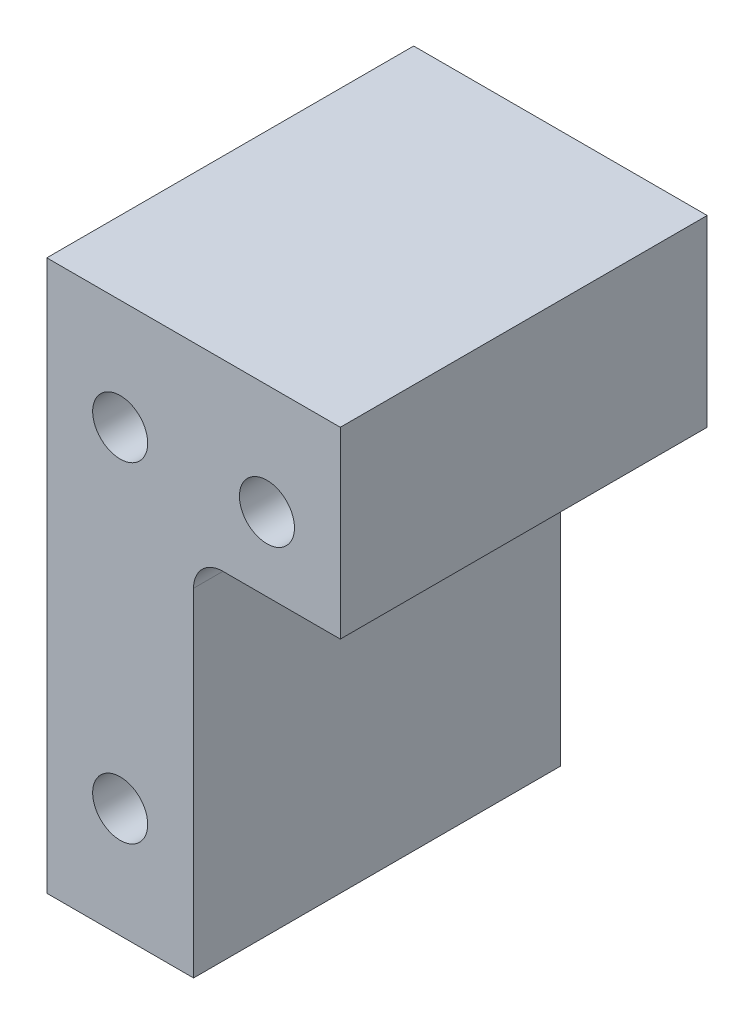
ISO-10303-21;
HEADER;
FILE_DESCRIPTION(('STEP AP214'),'2;1');
FILE_NAME('part.step','',(''),(''),'','','');
FILE_SCHEMA(('AUTOMOTIVE_DESIGN { 1 0 10303 214 1 1 1 1 }'));
ENDSEC;
DATA;
#1=APPLICATION_CONTEXT('core data for automotive mechanical design processes');
#2=APPLICATION_PROTOCOL_DEFINITION('international standard','automotive_design',2000,#1);
#3=PRODUCT_CONTEXT('',#1,'mechanical');
#4=PRODUCT('Part','Part','',(#3));
#5=PRODUCT_RELATED_PRODUCT_CATEGORY('part','',(#4));
#6=PRODUCT_DEFINITION_FORMATION('','',#4);
#7=PRODUCT_DEFINITION_CONTEXT('part definition',#1,'design');
#8=PRODUCT_DEFINITION('design','',#6,#7);
#9=PRODUCT_DEFINITION_SHAPE('','',#8);
#10=(LENGTH_UNIT() NAMED_UNIT(*) SI_UNIT(.MILLI.,.METRE.));
#11=(NAMED_UNIT(*) PLANE_ANGLE_UNIT() SI_UNIT($,.RADIAN.));
#12=(NAMED_UNIT(*) SI_UNIT($,.STERADIAN.) SOLID_ANGLE_UNIT());
#13=UNCERTAINTY_MEASURE_WITH_UNIT(LENGTH_MEASURE(1.E-05),#10,'distance_accuracy_value','');
#14=(GEOMETRIC_REPRESENTATION_CONTEXT(3) GLOBAL_UNCERTAINTY_ASSIGNED_CONTEXT((#13)) GLOBAL_UNIT_ASSIGNED_CONTEXT((#10,
#11,#12)) REPRESENTATION_CONTEXT('',''));
#15=CARTESIAN_POINT('',(0.,0.,0.));
#16=DIRECTION('',(0.,0.,1.));
#17=DIRECTION('',(1.,0.,0.));
#18=AXIS2_PLACEMENT_3D('',#15,#16,#17);
#19=CARTESIAN_POINT('',(12.192,23.368,25.4));
#20=DIRECTION('',(0.,0.,1.));
#21=DIRECTION('',(1.,0.,0.));
#22=AXIS2_PLACEMENT_3D('',#19,#20,#21);
#23=PLANE('',#22);
#24=CARTESIAN_POINT('',(5.08,7.62,25.4));
#25=DIRECTION('',(0.,0.,1.));
#26=DIRECTION('',(1.,0.,0.));
#27=AXIS2_PLACEMENT_3D('',#24,#25,#26);
#28=CIRCLE('',#27,1.905);
#29=CARTESIAN_POINT('',(6.985,7.62,25.4));
#30=VERTEX_POINT('',#29);
#31=EDGE_CURVE('E164',#30,#30,#28,.T.);
#32=ORIENTED_EDGE('',*,*,#31,.F.);
#33=EDGE_LOOP('',(#32));
#34=FACE_BOUND('',#33,.T.);
#35=DIRECTION('',(1.,0.,0.));
#36=VECTOR('',#35,1.);
#37=CARTESIAN_POINT('',(10.16,0.,25.4));
#38=LINE('',#37,#36);
#39=CARTESIAN_POINT('',(0.,0.,25.4));
#40=VERTEX_POINT('',#39);
#41=CARTESIAN_POINT('',(10.16,0.,25.4));
#42=VERTEX_POINT('',#41);
#43=EDGE_CURVE('E137',#40,#42,#38,.T.);
#44=ORIENTED_EDGE('',*,*,#43,.T.);
#45=DIRECTION('',(0.,1.,0.));
#46=VECTOR('',#45,1.);
#47=CARTESIAN_POINT('',(10.16,23.368,25.4));
#48=LINE('',#47,#46);
#49=CARTESIAN_POINT('',(10.16,23.368,25.4));
#50=VERTEX_POINT('',#49);
#51=EDGE_CURVE('E90',#42,#50,#48,.T.);
#52=ORIENTED_EDGE('',*,*,#51,.T.);
#53=CARTESIAN_POINT('',(12.192,23.368,25.4));
#54=DIRECTION('',(0.,0.,-1.));
#55=DIRECTION('',(1.,0.,0.));
#56=AXIS2_PLACEMENT_3D('',#53,#54,#55);
#57=CIRCLE('',#56,2.032);
#58=CARTESIAN_POINT('',(12.192,25.4,25.4));
#59=VERTEX_POINT('',#58);
#60=EDGE_CURVE('E149',#50,#59,#57,.T.);
#61=ORIENTED_EDGE('',*,*,#60,.T.);
#62=DIRECTION('',(1.,0.,0.));
#63=VECTOR('',#62,1.);
#64=CARTESIAN_POINT('',(20.32,25.4,25.4));
#65=LINE('',#64,#63);
#66=CARTESIAN_POINT('',(20.32,25.4,25.4));
#67=VERTEX_POINT('',#66);
#68=EDGE_CURVE('E106',#59,#67,#65,.T.);
#69=ORIENTED_EDGE('',*,*,#68,.T.);
#70=DIRECTION('',(0.,1.,0.));
#71=VECTOR('',#70,1.);
#72=CARTESIAN_POINT('',(20.32,38.1,25.4));
#73=LINE('',#72,#71);
#74=CARTESIAN_POINT('',(20.32,38.1,25.4));
#75=VERTEX_POINT('',#74);
#76=EDGE_CURVE('E100',#67,#75,#73,.T.);
#77=ORIENTED_EDGE('',*,*,#76,.T.);
#78=DIRECTION('',(-1.,0.,0.));
#79=VECTOR('',#78,1.);
#80=CARTESIAN_POINT('',(0.,38.1,25.4));
#81=LINE('',#80,#79);
#82=CARTESIAN_POINT('',(0.,38.1,25.4));
#83=VERTEX_POINT('',#82);
#84=EDGE_CURVE('E104',#75,#83,#81,.T.);
#85=ORIENTED_EDGE('',*,*,#84,.T.);
#86=DIRECTION('',(0.,-1.,0.));
#87=VECTOR('',#86,1.);
#88=CARTESIAN_POINT('',(0.,0.,25.4));
#89=LINE('',#88,#87);
#90=EDGE_CURVE('E50',#83,#40,#89,.T.);
#91=ORIENTED_EDGE('',*,*,#90,.T.);
#92=EDGE_LOOP('',(#44,#52,#61,#69,#77,#85,#91));
#93=FACE_BOUND('',#92,.T.);
#94=CARTESIAN_POINT('',(5.08,30.48,25.4));
#95=DIRECTION('',(0.,0.,1.));
#96=DIRECTION('',(1.,0.,0.));
#97=AXIS2_PLACEMENT_3D('',#94,#95,#96);
#98=CIRCLE('',#97,1.905);
#99=CARTESIAN_POINT('',(6.985,30.48,25.4));
#100=VERTEX_POINT('',#99);
#101=EDGE_CURVE('E128',#100,#100,#98,.T.);
#102=ORIENTED_EDGE('',*,*,#101,.F.);
#103=EDGE_LOOP('',(#102));
#104=FACE_BOUND('',#103,.T.);
#105=CARTESIAN_POINT('',(15.24,30.48,25.4));
#106=DIRECTION('',(0.,0.,1.));
#107=DIRECTION('',(1.,0.,0.));
#108=AXIS2_PLACEMENT_3D('',#105,#106,#107);
#109=CIRCLE('',#108,1.905);
#110=CARTESIAN_POINT('',(17.145,30.48,25.4));
#111=VERTEX_POINT('',#110);
#112=EDGE_CURVE('E170',#111,#111,#109,.T.);
#113=ORIENTED_EDGE('',*,*,#112,.F.);
#114=EDGE_LOOP('',(#113));
#115=FACE_BOUND('',#114,.T.);
#116=ADVANCED_FACE('F33',(#34,#93,#104,#115),#23,.T.);
#117=CARTESIAN_POINT('',(12.192,23.368,0.));
#118=DIRECTION('',(0.,0.,1.));
#119=DIRECTION('',(1.,0.,0.));
#120=AXIS2_PLACEMENT_3D('',#117,#118,#119);
#121=PLANE('',#120);
#122=DIRECTION('',(1.,0.,0.));
#123=VECTOR('',#122,1.);
#124=CARTESIAN_POINT('',(10.16,0.,0.));
#125=LINE('',#124,#123);
#126=CARTESIAN_POINT('',(0.,0.,0.));
#127=VERTEX_POINT('',#126);
#128=CARTESIAN_POINT('',(10.16,0.,0.));
#129=VERTEX_POINT('',#128);
#130=EDGE_CURVE('E124',#127,#129,#125,.T.);
#131=ORIENTED_EDGE('',*,*,#130,.F.);
#132=DIRECTION('',(0.,-1.,0.));
#133=VECTOR('',#132,1.);
#134=CARTESIAN_POINT('',(0.,0.,0.));
#135=LINE('',#134,#133);
#136=CARTESIAN_POINT('',(0.,38.1,0.));
#137=VERTEX_POINT('',#136);
#138=EDGE_CURVE('E82',#137,#127,#135,.T.);
#139=ORIENTED_EDGE('',*,*,#138,.F.);
#140=DIRECTION('',(-1.,0.,0.));
#141=VECTOR('',#140,1.);
#142=CARTESIAN_POINT('',(0.,38.1,0.));
#143=LINE('',#142,#141);
#144=CARTESIAN_POINT('',(20.32,38.1,0.));
#145=VERTEX_POINT('',#144);
#146=EDGE_CURVE('E76',#145,#137,#143,.T.);
#147=ORIENTED_EDGE('',*,*,#146,.F.);
#148=DIRECTION('',(0.,1.,0.));
#149=VECTOR('',#148,1.);
#150=CARTESIAN_POINT('',(20.32,38.1,0.));
#151=LINE('',#150,#149);
#152=CARTESIAN_POINT('',(20.32,25.4,0.));
#153=VERTEX_POINT('',#152);
#154=EDGE_CURVE('E114',#153,#145,#151,.T.);
#155=ORIENTED_EDGE('',*,*,#154,.F.);
#156=DIRECTION('',(1.,0.,0.));
#157=VECTOR('',#156,1.);
#158=CARTESIAN_POINT('',(20.32,25.4,0.));
#159=LINE('',#158,#157);
#160=CARTESIAN_POINT('',(12.192,25.4,0.));
#161=VERTEX_POINT('',#160);
#162=EDGE_CURVE('E132',#161,#153,#159,.T.);
#163=ORIENTED_EDGE('',*,*,#162,.F.);
#164=CARTESIAN_POINT('',(12.192,23.368,0.));
#165=DIRECTION('',(0.,0.,-1.));
#166=DIRECTION('',(1.,0.,0.));
#167=AXIS2_PLACEMENT_3D('',#164,#165,#166);
#168=CIRCLE('',#167,2.032);
#169=CARTESIAN_POINT('',(10.16,23.368,0.));
#170=VERTEX_POINT('',#169);
#171=EDGE_CURVE('E130',#170,#161,#168,.T.);
#172=ORIENTED_EDGE('',*,*,#171,.F.);
#173=DIRECTION('',(0.,1.,0.));
#174=VECTOR('',#173,1.);
#175=CARTESIAN_POINT('',(10.16,23.368,0.));
#176=LINE('',#175,#174);
#177=EDGE_CURVE('E127',#129,#170,#176,.T.);
#178=ORIENTED_EDGE('',*,*,#177,.F.);
#179=EDGE_LOOP('',(#131,#139,#147,#155,#163,#172,#178));
#180=FACE_BOUND('',#179,.T.);
#181=CARTESIAN_POINT('',(5.08,30.48,0.));
#182=DIRECTION('',(0.,0.,1.));
#183=DIRECTION('',(1.,0.,0.));
#184=AXIS2_PLACEMENT_3D('',#181,#182,#183);
#185=CIRCLE('',#184,1.905);
#186=CARTESIAN_POINT('',(6.985,30.48,0.));
#187=VERTEX_POINT('',#186);
#188=EDGE_CURVE('E161',#187,#187,#185,.T.);
#189=ORIENTED_EDGE('',*,*,#188,.T.);
#190=EDGE_LOOP('',(#189));
#191=FACE_BOUND('',#190,.T.);
#192=CARTESIAN_POINT('',(5.08,7.62,0.));
#193=DIRECTION('',(0.,0.,1.));
#194=DIRECTION('',(1.,0.,0.));
#195=AXIS2_PLACEMENT_3D('',#192,#193,#194);
#196=CIRCLE('',#195,1.905);
#197=CARTESIAN_POINT('',(6.985,7.62,0.));
#198=VERTEX_POINT('',#197);
#199=EDGE_CURVE('E167',#198,#198,#196,.T.);
#200=ORIENTED_EDGE('',*,*,#199,.T.);
#201=EDGE_LOOP('',(#200));
#202=FACE_BOUND('',#201,.T.);
#203=CARTESIAN_POINT('',(15.24,30.48,0.));
#204=DIRECTION('',(0.,0.,1.));
#205=DIRECTION('',(1.,0.,0.));
#206=AXIS2_PLACEMENT_3D('',#203,#204,#205);
#207=CIRCLE('',#206,1.905);
#208=CARTESIAN_POINT('',(17.145,30.48,0.));
#209=VERTEX_POINT('',#208);
#210=EDGE_CURVE('E173',#209,#209,#207,.T.);
#211=ORIENTED_EDGE('',*,*,#210,.T.);
#212=EDGE_LOOP('',(#211));
#213=FACE_BOUND('',#212,.T.);
#214=ADVANCED_FACE('F153',(#180,#191,#202,#213),#121,.F.);
#215=CARTESIAN_POINT('',(10.16,0.,25.4));
#216=DIRECTION('',(0.,1.,0.));
#217=DIRECTION('',(0.,0.,1.));
#218=AXIS2_PLACEMENT_3D('',#215,#216,#217);
#219=PLANE('',#218);
#220=ORIENTED_EDGE('',*,*,#130,.T.);
#221=DIRECTION('',(0.,0.,-1.));
#222=VECTOR('',#221,1.);
#223=CARTESIAN_POINT('',(10.16,0.,25.4));
#224=LINE('',#223,#222);
#225=EDGE_CURVE('E11',#42,#129,#224,.T.);
#226=ORIENTED_EDGE('',*,*,#225,.F.);
#227=ORIENTED_EDGE('',*,*,#43,.F.);
#228=DIRECTION('',(0.,0.,-1.));
#229=VECTOR('',#228,1.);
#230=CARTESIAN_POINT('',(0.,0.,25.4));
#231=LINE('',#230,#229);
#232=EDGE_CURVE('E120',#40,#127,#231,.T.);
#233=ORIENTED_EDGE('',*,*,#232,.T.);
#234=EDGE_LOOP('',(#220,#226,#227,#233));
#235=FACE_BOUND('',#234,.T.);
#236=ADVANCED_FACE('F35',(#235),#219,.F.);
#237=CARTESIAN_POINT('',(10.16,23.368,25.4));
#238=DIRECTION('',(-1.,0.,0.));
#239=DIRECTION('',(0.,0.,1.));
#240=AXIS2_PLACEMENT_3D('',#237,#238,#239);
#241=PLANE('',#240);
#242=ORIENTED_EDGE('',*,*,#177,.T.);
#243=DIRECTION('',(0.,0.,-1.));
#244=VECTOR('',#243,1.);
#245=CARTESIAN_POINT('',(10.16,23.368,25.4));
#246=LINE('',#245,#244);
#247=EDGE_CURVE('E42',#50,#170,#246,.T.);
#248=ORIENTED_EDGE('',*,*,#247,.F.);
#249=ORIENTED_EDGE('',*,*,#51,.F.);
#250=ORIENTED_EDGE('',*,*,#225,.T.);
#251=EDGE_LOOP('',(#242,#248,#249,#250));
#252=FACE_BOUND('',#251,.T.);
#253=ADVANCED_FACE('F204',(#252),#241,.F.);
#254=CARTESIAN_POINT('',(12.192,23.368,25.4));
#255=DIRECTION('',(0.,0.,-1.));
#256=DIRECTION('',(-1.,0.,0.));
#257=AXIS2_PLACEMENT_3D('',#254,#255,#256);
#258=CYLINDRICAL_SURFACE('',#257,2.032);
#259=ORIENTED_EDGE('',*,*,#171,.T.);
#260=DIRECTION('',(0.,0.,-1.));
#261=VECTOR('',#260,1.);
#262=CARTESIAN_POINT('',(12.192,25.4,25.4));
#263=LINE('',#262,#261);
#264=EDGE_CURVE('E141',#59,#161,#263,.T.);
#265=ORIENTED_EDGE('',*,*,#264,.F.);
#266=ORIENTED_EDGE('',*,*,#60,.F.);
#267=ORIENTED_EDGE('',*,*,#247,.T.);
#268=EDGE_LOOP('',(#259,#265,#266,#267));
#269=FACE_BOUND('',#268,.T.);
#270=ADVANCED_FACE('F147',(#269),#258,.F.);
#271=CARTESIAN_POINT('',(20.32,25.4,25.4));
#272=DIRECTION('',(0.,1.,0.));
#273=DIRECTION('',(-1.,0.,0.));
#274=AXIS2_PLACEMENT_3D('',#271,#272,#273);
#275=PLANE('',#274);
#276=ORIENTED_EDGE('',*,*,#162,.T.);
#277=DIRECTION('',(0.,0.,-1.));
#278=VECTOR('',#277,1.);
#279=CARTESIAN_POINT('',(20.32,25.4,25.4));
#280=LINE('',#279,#278);
#281=EDGE_CURVE('E115',#67,#153,#280,.T.);
#282=ORIENTED_EDGE('',*,*,#281,.F.);
#283=ORIENTED_EDGE('',*,*,#68,.F.);
#284=ORIENTED_EDGE('',*,*,#264,.T.);
#285=EDGE_LOOP('',(#276,#282,#283,#284));
#286=FACE_BOUND('',#285,.T.);
#287=ADVANCED_FACE('F156',(#286),#275,.F.);
#288=CARTESIAN_POINT('',(20.32,38.1,25.4));
#289=DIRECTION('',(-1.,0.,0.));
#290=DIRECTION('',(0.,0.,1.));
#291=AXIS2_PLACEMENT_3D('',#288,#289,#290);
#292=PLANE('',#291);
#293=ORIENTED_EDGE('',*,*,#154,.T.);
#294=DIRECTION('',(0.,0.,-1.));
#295=VECTOR('',#294,1.);
#296=CARTESIAN_POINT('',(20.32,38.1,25.4));
#297=LINE('',#296,#295);
#298=EDGE_CURVE('E111',#75,#145,#297,.T.);
#299=ORIENTED_EDGE('',*,*,#298,.F.);
#300=ORIENTED_EDGE('',*,*,#76,.F.);
#301=ORIENTED_EDGE('',*,*,#281,.T.);
#302=EDGE_LOOP('',(#293,#299,#300,#301));
#303=FACE_BOUND('',#302,.T.);
#304=ADVANCED_FACE('F112',(#303),#292,.F.);
#305=CARTESIAN_POINT('',(0.,38.1,25.4));
#306=DIRECTION('',(0.,-1.,0.));
#307=DIRECTION('',(0.,0.,-1.));
#308=AXIS2_PLACEMENT_3D('',#305,#306,#307);
#309=PLANE('',#308);
#310=ORIENTED_EDGE('',*,*,#146,.T.);
#311=DIRECTION('',(0.,0.,-1.));
#312=VECTOR('',#311,1.);
#313=CARTESIAN_POINT('',(0.,38.1,25.4));
#314=LINE('',#313,#312);
#315=EDGE_CURVE('E116',#83,#137,#314,.T.);
#316=ORIENTED_EDGE('',*,*,#315,.F.);
#317=ORIENTED_EDGE('',*,*,#84,.F.);
#318=ORIENTED_EDGE('',*,*,#298,.T.);
#319=EDGE_LOOP('',(#310,#316,#317,#318));
#320=FACE_BOUND('',#319,.T.);
#321=ADVANCED_FACE('F118',(#320),#309,.F.);
#322=CARTESIAN_POINT('',(0.,0.,25.4));
#323=DIRECTION('',(1.,0.,0.));
#324=DIRECTION('',(0.,0.,-1.));
#325=AXIS2_PLACEMENT_3D('',#322,#323,#324);
#326=PLANE('',#325);
#327=ORIENTED_EDGE('',*,*,#138,.T.);
#328=ORIENTED_EDGE('',*,*,#232,.F.);
#329=ORIENTED_EDGE('',*,*,#90,.F.);
#330=ORIENTED_EDGE('',*,*,#315,.T.);
#331=EDGE_LOOP('',(#327,#328,#329,#330));
#332=FACE_BOUND('',#331,.T.);
#333=ADVANCED_FACE('F194',(#332),#326,.F.);
#334=CARTESIAN_POINT('',(5.08,30.48,25.4));
#335=DIRECTION('',(0.,0.,-1.));
#336=DIRECTION('',(-1.,0.,0.));
#337=AXIS2_PLACEMENT_3D('',#334,#335,#336);
#338=CYLINDRICAL_SURFACE('',#337,1.905);
#339=ORIENTED_EDGE('',*,*,#101,.T.);
#340=EDGE_LOOP('',(#339));
#341=FACE_BOUND('',#340,.T.);
#342=ORIENTED_EDGE('',*,*,#188,.F.);
#343=EDGE_LOOP('',(#342));
#344=FACE_BOUND('',#343,.T.);
#345=ADVANCED_FACE('F191',(#341,#344),#338,.F.);
#346=CARTESIAN_POINT('',(5.08,7.62,25.4));
#347=DIRECTION('',(0.,0.,-1.));
#348=DIRECTION('',(-1.,0.,0.));
#349=AXIS2_PLACEMENT_3D('',#346,#347,#348);
#350=CYLINDRICAL_SURFACE('',#349,1.905);
#351=ORIENTED_EDGE('',*,*,#31,.T.);
#352=EDGE_LOOP('',(#351));
#353=FACE_BOUND('',#352,.T.);
#354=ORIENTED_EDGE('',*,*,#199,.F.);
#355=EDGE_LOOP('',(#354));
#356=FACE_BOUND('',#355,.T.);
#357=ADVANCED_FACE('F263',(#353,#356),#350,.F.);
#358=CARTESIAN_POINT('',(15.24,30.48,25.4));
#359=DIRECTION('',(0.,0.,-1.));
#360=DIRECTION('',(-1.,0.,0.));
#361=AXIS2_PLACEMENT_3D('',#358,#359,#360);
#362=CYLINDRICAL_SURFACE('',#361,1.905);
#363=ORIENTED_EDGE('',*,*,#112,.T.);
#364=EDGE_LOOP('',(#363));
#365=FACE_BOUND('',#364,.T.);
#366=ORIENTED_EDGE('',*,*,#210,.F.);
#367=EDGE_LOOP('',(#366));
#368=FACE_BOUND('',#367,.T.);
#369=ADVANCED_FACE('F179',(#365,#368),#362,.F.);
#370=CLOSED_SHELL('',(#116,#214,#236,#253,#270,#287,#304,#321,#333,#345,#357,#369));
#371=MANIFOLD_SOLID_BREP('B2',#370);
#372=ADVANCED_BREP_SHAPE_REPRESENTATION('',(#18,#371),#14);
#373=SHAPE_DEFINITION_REPRESENTATION(#9,#372);
ENDSEC;
END-ISO-10303-21;
